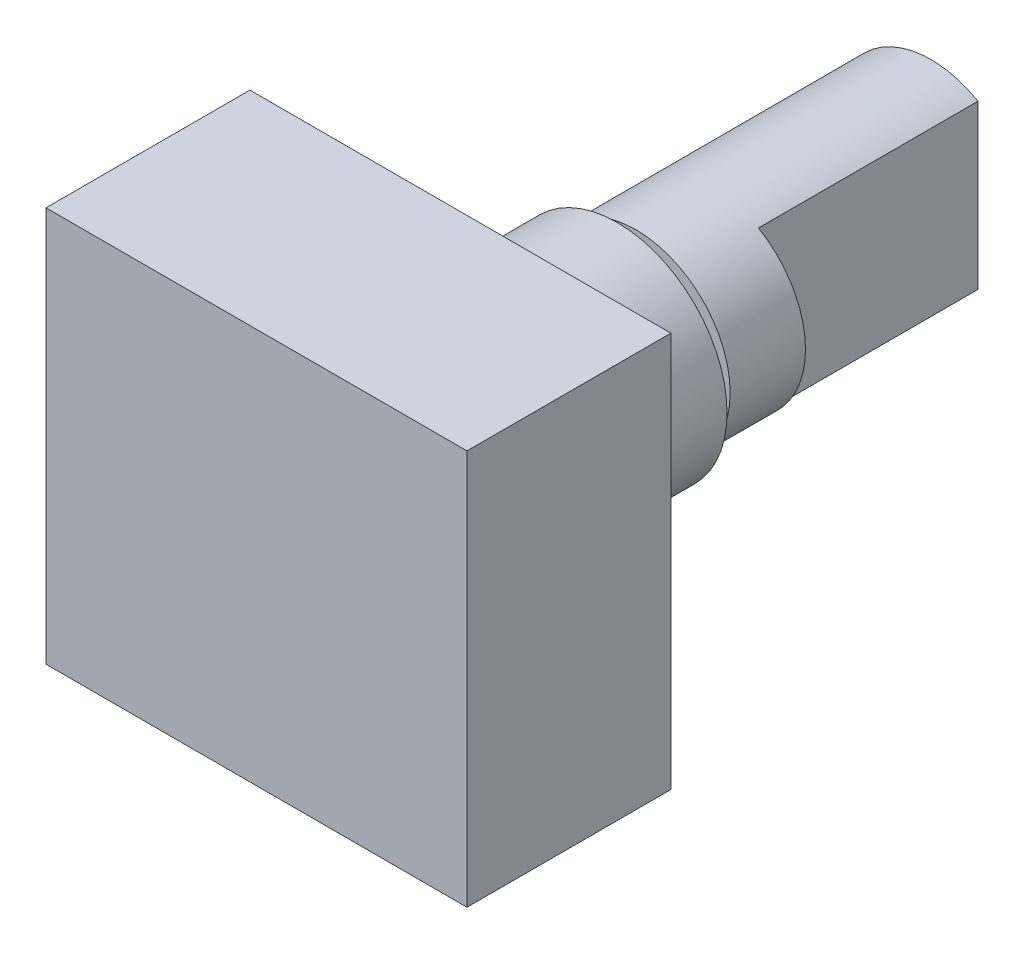
ISO-10303-21;
HEADER;
FILE_DESCRIPTION(('STEP AP214'),'2;1');
FILE_NAME('part.step','',(''),(''),'','','');
FILE_SCHEMA(('AUTOMOTIVE_DESIGN { 1 0 10303 214 1 1 1 1 }'));
ENDSEC;
DATA;
#1=APPLICATION_CONTEXT('core data for automotive mechanical design processes');
#2=APPLICATION_PROTOCOL_DEFINITION('international standard','automotive_design',2000,#1);
#3=PRODUCT_CONTEXT('',#1,'mechanical');
#4=PRODUCT('Part','Part','',(#3));
#5=PRODUCT_RELATED_PRODUCT_CATEGORY('part','',(#4));
#6=PRODUCT_DEFINITION_FORMATION('','',#4);
#7=PRODUCT_DEFINITION_CONTEXT('part definition',#1,'design');
#8=PRODUCT_DEFINITION('design','',#6,#7);
#9=PRODUCT_DEFINITION_SHAPE('','',#8);
#10=(LENGTH_UNIT() NAMED_UNIT(*) SI_UNIT(.MILLI.,.METRE.));
#11=(NAMED_UNIT(*) PLANE_ANGLE_UNIT() SI_UNIT($,.RADIAN.));
#12=(NAMED_UNIT(*) SI_UNIT($,.STERADIAN.) SOLID_ANGLE_UNIT());
#13=UNCERTAINTY_MEASURE_WITH_UNIT(LENGTH_MEASURE(1.E-05),#10,'distance_accuracy_value','');
#14=(GEOMETRIC_REPRESENTATION_CONTEXT(3) GLOBAL_UNCERTAINTY_ASSIGNED_CONTEXT((#13)) GLOBAL_UNIT_ASSIGNED_CONTEXT((#10,
#11,#12)) REPRESENTATION_CONTEXT('',''));
#15=CARTESIAN_POINT('',(0.,0.,0.));
#16=DIRECTION('',(0.,0.,1.));
#17=DIRECTION('',(1.,0.,0.));
#18=AXIS2_PLACEMENT_3D('',#15,#16,#17);
#19=CARTESIAN_POINT('',(6.71,6.3,6.5));
#20=DIRECTION('',(-1.,0.,0.));
#21=DIRECTION('',(0.,-1.,0.));
#22=AXIS2_PLACEMENT_3D('',#19,#20,#21);
#23=PLANE('',#22);
#24=DIRECTION('',(0.,1.,0.));
#25=VECTOR('',#24,1.);
#26=CARTESIAN_POINT('',(6.71,6.3,0.));
#27=LINE('',#26,#25);
#28=CARTESIAN_POINT('',(6.71,-6.3,0.));
#29=VERTEX_POINT('',#28);
#30=CARTESIAN_POINT('',(6.71,6.3,0.));
#31=VERTEX_POINT('',#30);
#32=EDGE_CURVE('E146',#29,#31,#27,.T.);
#33=ORIENTED_EDGE('',*,*,#32,.T.);
#34=DIRECTION('',(0.,0.,-1.));
#35=VECTOR('',#34,1.);
#36=CARTESIAN_POINT('',(6.71,6.3,6.5));
#37=LINE('',#36,#35);
#38=CARTESIAN_POINT('',(6.71,6.3,6.5));
#39=VERTEX_POINT('',#38);
#40=EDGE_CURVE('E178',#39,#31,#37,.T.);
#41=ORIENTED_EDGE('',*,*,#40,.F.);
#42=DIRECTION('',(0.,1.,0.));
#43=VECTOR('',#42,1.);
#44=CARTESIAN_POINT('',(6.71,6.3,6.5));
#45=LINE('',#44,#43);
#46=CARTESIAN_POINT('',(6.71,-6.3,6.5));
#47=VERTEX_POINT('',#46);
#48=EDGE_CURVE('E147',#47,#39,#45,.T.);
#49=ORIENTED_EDGE('',*,*,#48,.F.);
#50=DIRECTION('',(0.,0.,-1.));
#51=VECTOR('',#50,1.);
#52=CARTESIAN_POINT('',(6.71,-6.3,6.5));
#53=LINE('',#52,#51);
#54=EDGE_CURVE('E157',#47,#29,#53,.T.);
#55=ORIENTED_EDGE('',*,*,#54,.T.);
#56=EDGE_LOOP('',(#33,#41,#49,#55));
#57=FACE_BOUND('',#56,.T.);
#58=ADVANCED_FACE('F43',(#57),#23,.F.);
#59=CARTESIAN_POINT('',(-6.71,6.3,6.5));
#60=DIRECTION('',(0.,-1.,0.));
#61=DIRECTION('',(0.,0.,-1.));
#62=AXIS2_PLACEMENT_3D('',#59,#60,#61);
#63=PLANE('',#62);
#64=DIRECTION('',(-1.,0.,0.));
#65=VECTOR('',#64,1.);
#66=CARTESIAN_POINT('',(-6.71,6.3,0.));
#67=LINE('',#66,#65);
#68=CARTESIAN_POINT('',(-6.71,6.3,0.));
#69=VERTEX_POINT('',#68);
#70=EDGE_CURVE('E161',#31,#69,#67,.T.);
#71=ORIENTED_EDGE('',*,*,#70,.T.);
#72=DIRECTION('',(0.,0.,-1.));
#73=VECTOR('',#72,1.);
#74=CARTESIAN_POINT('',(-6.71,6.3,6.5));
#75=LINE('',#74,#73);
#76=CARTESIAN_POINT('',(-6.71,6.3,6.5));
#77=VERTEX_POINT('',#76);
#78=EDGE_CURVE('E174',#77,#69,#75,.T.);
#79=ORIENTED_EDGE('',*,*,#78,.F.);
#80=DIRECTION('',(-1.,0.,0.));
#81=VECTOR('',#80,1.);
#82=CARTESIAN_POINT('',(-6.71,6.3,6.5));
#83=LINE('',#82,#81);
#84=EDGE_CURVE('E96',#39,#77,#83,.T.);
#85=ORIENTED_EDGE('',*,*,#84,.F.);
#86=ORIENTED_EDGE('',*,*,#40,.T.);
#87=EDGE_LOOP('',(#71,#79,#85,#86));
#88=FACE_BOUND('',#87,.T.);
#89=ADVANCED_FACE('F194',(#88),#63,.F.);
#90=CARTESIAN_POINT('',(-6.71,6.3,6.5));
#91=DIRECTION('',(1.,0.,0.));
#92=DIRECTION('',(0.,1.,0.));
#93=AXIS2_PLACEMENT_3D('',#90,#91,#92);
#94=PLANE('',#93);
#95=DIRECTION('',(0.,-1.,0.));
#96=VECTOR('',#95,1.);
#97=CARTESIAN_POINT('',(-6.71,6.3,0.));
#98=LINE('',#97,#96);
#99=CARTESIAN_POINT('',(-6.71,-6.3,0.));
#100=VERTEX_POINT('',#99);
#101=EDGE_CURVE('E164',#69,#100,#98,.T.);
#102=ORIENTED_EDGE('',*,*,#101,.T.);
#103=DIRECTION('',(0.,0.,-1.));
#104=VECTOR('',#103,1.);
#105=CARTESIAN_POINT('',(-6.71,-6.3,6.5));
#106=LINE('',#105,#104);
#107=CARTESIAN_POINT('',(-6.71,-6.3,6.5));
#108=VERTEX_POINT('',#107);
#109=EDGE_CURVE('E171',#108,#100,#106,.T.);
#110=ORIENTED_EDGE('',*,*,#109,.F.);
#111=DIRECTION('',(0.,-1.,0.));
#112=VECTOR('',#111,1.);
#113=CARTESIAN_POINT('',(-6.71,6.3,6.5));
#114=LINE('',#113,#112);
#115=EDGE_CURVE('E152',#77,#108,#114,.T.);
#116=ORIENTED_EDGE('',*,*,#115,.F.);
#117=ORIENTED_EDGE('',*,*,#78,.T.);
#118=EDGE_LOOP('',(#102,#110,#116,#117));
#119=FACE_BOUND('',#118,.T.);
#120=ADVANCED_FACE('F199',(#119),#94,.F.);
#121=CARTESIAN_POINT('',(-6.71,-6.3,6.5));
#122=DIRECTION('',(0.,1.,0.));
#123=DIRECTION('',(0.,0.,1.));
#124=AXIS2_PLACEMENT_3D('',#121,#122,#123);
#125=PLANE('',#124);
#126=DIRECTION('',(1.,0.,0.));
#127=VECTOR('',#126,1.);
#128=CARTESIAN_POINT('',(-6.71,-6.3,0.));
#129=LINE('',#128,#127);
#130=EDGE_CURVE('E88',#100,#29,#129,.T.);
#131=ORIENTED_EDGE('',*,*,#130,.T.);
#132=ORIENTED_EDGE('',*,*,#54,.F.);
#133=DIRECTION('',(1.,0.,0.));
#134=VECTOR('',#133,1.);
#135=CARTESIAN_POINT('',(-6.71,-6.3,6.5));
#136=LINE('',#135,#134);
#137=EDGE_CURVE('E67',#108,#47,#136,.T.);
#138=ORIENTED_EDGE('',*,*,#137,.F.);
#139=ORIENTED_EDGE('',*,*,#109,.T.);
#140=EDGE_LOOP('',(#131,#132,#138,#139));
#141=FACE_BOUND('',#140,.T.);
#142=ADVANCED_FACE('F211',(#141),#125,.F.);
#143=CARTESIAN_POINT('',(0.,0.,6.5));
#144=DIRECTION('',(0.,0.,1.));
#145=DIRECTION('',(1.,0.,0.));
#146=AXIS2_PLACEMENT_3D('',#143,#144,#145);
#147=PLANE('',#146);
#148=ORIENTED_EDGE('',*,*,#48,.T.);
#149=ORIENTED_EDGE('',*,*,#84,.T.);
#150=ORIENTED_EDGE('',*,*,#115,.T.);
#151=ORIENTED_EDGE('',*,*,#137,.T.);
#152=EDGE_LOOP('',(#148,#149,#150,#151));
#153=FACE_BOUND('',#152,.T.);
#154=ADVANCED_FACE('F209',(#153),#147,.T.);
#155=CARTESIAN_POINT('',(0.,0.,0.));
#156=DIRECTION('',(0.,0.,1.));
#157=DIRECTION('',(1.,0.,0.));
#158=AXIS2_PLACEMENT_3D('',#155,#156,#157);
#159=PLANE('',#158);
#160=CARTESIAN_POINT('',(0.,0.,0.));
#161=DIRECTION('',(0.,0.,1.));
#162=DIRECTION('',(1.,0.,0.));
#163=AXIS2_PLACEMENT_3D('',#160,#161,#162);
#164=CIRCLE('',#163,3.5);
#165=CARTESIAN_POINT('',(3.5,0.,0.));
#166=VERTEX_POINT('',#165);
#167=EDGE_CURVE('E142',#166,#166,#164,.T.);
#168=ORIENTED_EDGE('',*,*,#167,.T.);
#169=EDGE_LOOP('',(#168));
#170=FACE_BOUND('',#169,.T.);
#171=ORIENTED_EDGE('',*,*,#32,.F.);
#172=ORIENTED_EDGE('',*,*,#130,.F.);
#173=ORIENTED_EDGE('',*,*,#101,.F.);
#174=ORIENTED_EDGE('',*,*,#70,.F.);
#175=EDGE_LOOP('',(#171,#172,#173,#174));
#176=FACE_BOUND('',#175,.T.);
#177=ADVANCED_FACE('F204',(#170,#176),#159,.F.);
#178=CARTESIAN_POINT('',(0.,0.,0.));
#179=DIRECTION('',(0.,0.,1.));
#180=DIRECTION('',(1.,0.,0.));
#181=AXIS2_PLACEMENT_3D('',#178,#179,#180);
#182=CYLINDRICAL_SURFACE('',#181,3.5);
#183=CARTESIAN_POINT('',(0.,0.,-5.));
#184=DIRECTION('',(0.,0.,1.));
#185=DIRECTION('',(1.,0.,0.));
#186=AXIS2_PLACEMENT_3D('',#183,#184,#185);
#187=CIRCLE('',#186,3.5);
#188=CARTESIAN_POINT('',(3.5,0.,-5.));
#189=VERTEX_POINT('',#188);
#190=EDGE_CURVE('E138',#189,#189,#187,.T.);
#191=ORIENTED_EDGE('',*,*,#190,.T.);
#192=EDGE_LOOP('',(#191));
#193=FACE_BOUND('',#192,.T.);
#194=ORIENTED_EDGE('',*,*,#167,.F.);
#195=EDGE_LOOP('',(#194));
#196=FACE_BOUND('',#195,.T.);
#197=ADVANCED_FACE('F217',(#193,#196),#182,.T.);
#198=CARTESIAN_POINT('',(3.5,0.,-5.));
#199=DIRECTION('',(0.,0.,-1.));
#200=DIRECTION('',(-1.,0.,0.));
#201=AXIS2_PLACEMENT_3D('',#198,#199,#200);
#202=PLANE('',#201);
#203=CARTESIAN_POINT('',(0.,0.,-5.));
#204=DIRECTION('',(0.,0.,1.));
#205=DIRECTION('',(1.,0.,0.));
#206=AXIS2_PLACEMENT_3D('',#203,#204,#205);
#207=CIRCLE('',#206,2.06386224665982);
#208=CARTESIAN_POINT('',(2.06386224665982,0.,-5.));
#209=VERTEX_POINT('',#208);
#210=EDGE_CURVE('E134',#209,#209,#207,.T.);
#211=ORIENTED_EDGE('',*,*,#210,.T.);
#212=EDGE_LOOP('',(#211));
#213=FACE_BOUND('',#212,.T.);
#214=ORIENTED_EDGE('',*,*,#190,.F.);
#215=EDGE_LOOP('',(#214));
#216=FACE_BOUND('',#215,.T.);
#217=ADVANCED_FACE('F255',(#213,#216),#202,.T.);
#218=CARTESIAN_POINT('',(0.,0.,0.));
#219=DIRECTION('',(0.,0.,1.));
#220=DIRECTION('',(1.,0.,0.));
#221=AXIS2_PLACEMENT_3D('',#218,#219,#220);
#222=CYLINDRICAL_SURFACE('',#221,2.06386224665982);
#223=CARTESIAN_POINT('',(0.,0.,-5.59928098538818));
#224=DIRECTION('',(0.,0.,1.));
#225=DIRECTION('',(1.,0.,0.));
#226=AXIS2_PLACEMENT_3D('',#223,#224,#225);
#227=CIRCLE('',#226,2.06386224665982);
#228=CARTESIAN_POINT('',(2.06386224665982,0.,-5.59928098538818));
#229=VERTEX_POINT('',#228);
#230=EDGE_CURVE('E130',#229,#229,#227,.T.);
#231=ORIENTED_EDGE('',*,*,#230,.T.);
#232=EDGE_LOOP('',(#231));
#233=FACE_BOUND('',#232,.T.);
#234=ORIENTED_EDGE('',*,*,#210,.F.);
#235=EDGE_LOOP('',(#234));
#236=FACE_BOUND('',#235,.T.);
#237=ADVANCED_FACE('F265',(#233,#236),#222,.T.);
#238=CARTESIAN_POINT('',(2.06386224665982,0.,-5.59928098538818));
#239=DIRECTION('',(0.,0.,1.));
#240=DIRECTION('',(1.,0.,0.));
#241=AXIS2_PLACEMENT_3D('',#238,#239,#240);
#242=PLANE('',#241);
#243=CARTESIAN_POINT('',(0.,0.,-5.59928098538818));
#244=DIRECTION('',(0.,0.,1.));
#245=DIRECTION('',(1.,0.,0.));
#246=AXIS2_PLACEMENT_3D('',#243,#244,#245);
#247=CIRCLE('',#246,3.);
#248=CARTESIAN_POINT('',(3.,0.,-5.59928098538818));
#249=VERTEX_POINT('',#248);
#250=EDGE_CURVE('E123',#249,#249,#247,.T.);
#251=ORIENTED_EDGE('',*,*,#250,.T.);
#252=EDGE_LOOP('',(#251));
#253=FACE_BOUND('',#252,.T.);
#254=ORIENTED_EDGE('',*,*,#230,.F.);
#255=EDGE_LOOP('',(#254));
#256=FACE_BOUND('',#255,.T.);
#257=ADVANCED_FACE('F190',(#253,#256),#242,.T.);
#258=CARTESIAN_POINT('',(0.,0.,0.));
#259=DIRECTION('',(0.,0.,1.));
#260=DIRECTION('',(1.,0.,0.));
#261=AXIS2_PLACEMENT_3D('',#258,#259,#260);
#262=CYLINDRICAL_SURFACE('',#261,3.);
#263=DIRECTION('',(0.,0.,1.));
#264=VECTOR('',#263,1.);
#265=CARTESIAN_POINT('',(1.5,-2.59807621135332,0.));
#266=LINE('',#265,#264);
#267=CARTESIAN_POINT('',(1.5,-2.59807621135332,-8.));
#268=VERTEX_POINT('',#267);
#269=CARTESIAN_POINT('',(1.5,-2.59807621135332,-15.));
#270=VERTEX_POINT('',#269);
#271=EDGE_CURVE('E58',#268,#270,#266,.F.);
#272=ORIENTED_EDGE('',*,*,#271,.F.);
#273=CARTESIAN_POINT('',(0.,0.,-8.));
#274=DIRECTION('',(0.,0.,1.));
#275=DIRECTION('',(1.,0.,0.));
#276=AXIS2_PLACEMENT_3D('',#273,#274,#275);
#277=CIRCLE('',#276,3.);
#278=CARTESIAN_POINT('',(1.5,2.59807621135331,-8.));
#279=VERTEX_POINT('',#278);
#280=EDGE_CURVE('E11',#279,#268,#277,.F.);
#281=ORIENTED_EDGE('',*,*,#280,.F.);
#282=DIRECTION('',(0.,0.,1.));
#283=VECTOR('',#282,1.);
#284=CARTESIAN_POINT('',(1.5,2.59807621135332,0.));
#285=LINE('',#284,#283);
#286=CARTESIAN_POINT('',(1.5,2.59807621135332,-15.));
#287=VERTEX_POINT('',#286);
#288=EDGE_CURVE('E111',#287,#279,#285,.T.);
#289=ORIENTED_EDGE('',*,*,#288,.F.);
#290=CARTESIAN_POINT('',(0.,0.,-15.));
#291=DIRECTION('',(0.,0.,1.));
#292=DIRECTION('',(1.,0.,0.));
#293=AXIS2_PLACEMENT_3D('',#290,#291,#292);
#294=CIRCLE('',#293,3.);
#295=EDGE_CURVE('E118',#287,#270,#294,.T.);
#296=ORIENTED_EDGE('',*,*,#295,.T.);
#297=EDGE_LOOP('',(#272,#281,#289,#296));
#298=FACE_BOUND('',#297,.T.);
#299=ORIENTED_EDGE('',*,*,#250,.F.);
#300=EDGE_LOOP('',(#299));
#301=FACE_BOUND('',#300,.T.);
#302=ADVANCED_FACE('F115',(#298,#301),#262,.T.);
#303=CARTESIAN_POINT('',(3.,0.,-15.));
#304=DIRECTION('',(0.,0.,-1.));
#305=DIRECTION('',(-1.,0.,0.));
#306=AXIS2_PLACEMENT_3D('',#303,#304,#305);
#307=PLANE('',#306);
#308=DIRECTION('',(0.,1.,0.));
#309=VECTOR('',#308,1.);
#310=CARTESIAN_POINT('',(1.5,0.,-15.));
#311=LINE('',#310,#309);
#312=EDGE_CURVE('E51',#270,#287,#311,.T.);
#313=ORIENTED_EDGE('',*,*,#312,.F.);
#314=ORIENTED_EDGE('',*,*,#295,.F.);
#315=EDGE_LOOP('',(#313,#314));
#316=FACE_BOUND('',#315,.T.);
#317=ADVANCED_FACE('F182',(#316),#307,.T.);
#318=CARTESIAN_POINT('',(1.5,-6.3,-8.));
#319=DIRECTION('',(0.,0.,1.));
#320=DIRECTION('',(1.,0.,0.));
#321=AXIS2_PLACEMENT_3D('',#318,#319,#320);
#322=PLANE('',#321);
#323=ORIENTED_EDGE('',*,*,#280,.T.);
#324=DIRECTION('',(0.,1.,0.));
#325=VECTOR('',#324,1.);
#326=CARTESIAN_POINT('',(1.5,-6.3,-8.));
#327=LINE('',#326,#325);
#328=EDGE_CURVE('E107',#268,#279,#327,.T.);
#329=ORIENTED_EDGE('',*,*,#328,.T.);
#330=EDGE_LOOP('',(#323,#329));
#331=FACE_BOUND('',#330,.T.);
#332=ADVANCED_FACE('F106',(#331),#322,.F.);
#333=CARTESIAN_POINT('',(1.5,-6.3,-15.));
#334=DIRECTION('',(-1.,0.,0.));
#335=DIRECTION('',(0.,0.,1.));
#336=AXIS2_PLACEMENT_3D('',#333,#334,#335);
#337=PLANE('',#336);
#338=ORIENTED_EDGE('',*,*,#271,.T.);
#339=ORIENTED_EDGE('',*,*,#312,.T.);
#340=ORIENTED_EDGE('',*,*,#288,.T.);
#341=ORIENTED_EDGE('',*,*,#328,.F.);
#342=EDGE_LOOP('',(#338,#339,#340,#341));
#343=FACE_BOUND('',#342,.T.);
#344=ADVANCED_FACE('F110',(#343),#337,.F.);
#345=CLOSED_SHELL('',(#58,#89,#120,#142,#154,#177,#197,#217,#237,#257,#302,#317,#332,#344));
#346=MANIFOLD_SOLID_BREP('B2',#345);
#347=ADVANCED_BREP_SHAPE_REPRESENTATION('',(#18,#346),#14);
#348=SHAPE_DEFINITION_REPRESENTATION(#9,#347);
ENDSEC;
END-ISO-10303-21;
